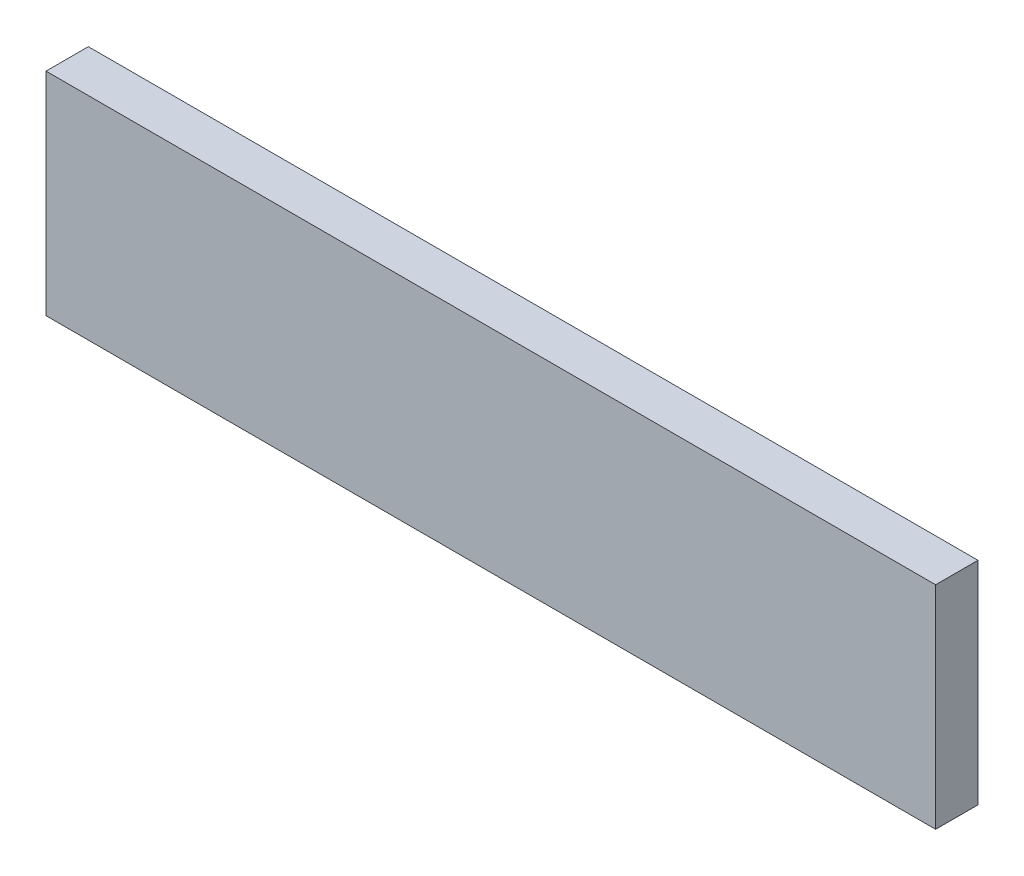
ISO-10303-21;
HEADER;
FILE_DESCRIPTION(('STEP AP214'),'2;1');
FILE_NAME('part.step','',(''),(''),'','','');
FILE_SCHEMA(('AUTOMOTIVE_DESIGN { 1 0 10303 214 1 1 1 1 }'));
ENDSEC;
DATA;
#1=APPLICATION_CONTEXT('core data for automotive mechanical design processes');
#2=APPLICATION_PROTOCOL_DEFINITION('international standard','automotive_design',2000,#1);
#3=PRODUCT_CONTEXT('',#1,'mechanical');
#4=PRODUCT('Part','Part','',(#3));
#5=PRODUCT_RELATED_PRODUCT_CATEGORY('part','',(#4));
#6=PRODUCT_DEFINITION_FORMATION('','',#4);
#7=PRODUCT_DEFINITION_CONTEXT('part definition',#1,'design');
#8=PRODUCT_DEFINITION('design','',#6,#7);
#9=PRODUCT_DEFINITION_SHAPE('','',#8);
#10=(LENGTH_UNIT() NAMED_UNIT(*) SI_UNIT(.MILLI.,.METRE.));
#11=(NAMED_UNIT(*) PLANE_ANGLE_UNIT() SI_UNIT($,.RADIAN.));
#12=(NAMED_UNIT(*) SI_UNIT($,.STERADIAN.) SOLID_ANGLE_UNIT());
#13=UNCERTAINTY_MEASURE_WITH_UNIT(LENGTH_MEASURE(1.E-05),#10,'distance_accuracy_value','');
#14=(GEOMETRIC_REPRESENTATION_CONTEXT(3) GLOBAL_UNCERTAINTY_ASSIGNED_CONTEXT((#13)) GLOBAL_UNIT_ASSIGNED_CONTEXT((#10,
#11,#12)) REPRESENTATION_CONTEXT('',''));
#15=CARTESIAN_POINT('',(0.,0.,0.));
#16=DIRECTION('',(0.,0.,1.));
#17=DIRECTION('',(1.,0.,0.));
#18=AXIS2_PLACEMENT_3D('',#15,#16,#17);
#19=CARTESIAN_POINT('',(0.,100.,0.));
#20=DIRECTION('',(1.,0.,0.));
#21=DIRECTION('',(0.,0.,-1.));
#22=AXIS2_PLACEMENT_3D('',#19,#20,#21);
#23=PLANE('',#22);
#24=DIRECTION('',(0.,0.,1.));
#25=VECTOR('',#24,1.);
#26=CARTESIAN_POINT('',(0.,0.,0.));
#27=LINE('',#26,#25);
#28=CARTESIAN_POINT('',(0.,0.,0.));
#29=VERTEX_POINT('',#28);
#30=CARTESIAN_POINT('',(0.,0.,20.));
#31=VERTEX_POINT('',#30);
#32=EDGE_CURVE('E107',#29,#31,#27,.T.);
#33=ORIENTED_EDGE('',*,*,#32,.T.);
#34=DIRECTION('',(0.,-1.,0.));
#35=VECTOR('',#34,1.);
#36=CARTESIAN_POINT('',(0.,100.,20.));
#37=LINE('',#36,#35);
#38=CARTESIAN_POINT('',(0.,100.,20.));
#39=VERTEX_POINT('',#38);
#40=EDGE_CURVE('E11',#39,#31,#37,.T.);
#41=ORIENTED_EDGE('',*,*,#40,.F.);
#42=DIRECTION('',(0.,0.,1.));
#43=VECTOR('',#42,1.);
#44=CARTESIAN_POINT('',(0.,100.,0.));
#45=LINE('',#44,#43);
#46=CARTESIAN_POINT('',(0.,100.,0.));
#47=VERTEX_POINT('',#46);
#48=EDGE_CURVE('E91',#47,#39,#45,.T.);
#49=ORIENTED_EDGE('',*,*,#48,.F.);
#50=DIRECTION('',(0.,-1.,0.));
#51=VECTOR('',#50,1.);
#52=CARTESIAN_POINT('',(0.,100.,0.));
#53=LINE('',#52,#51);
#54=EDGE_CURVE('E103',#47,#29,#53,.T.);
#55=ORIENTED_EDGE('',*,*,#54,.T.);
#56=EDGE_LOOP('',(#33,#41,#49,#55));
#57=FACE_BOUND('',#56,.T.);
#58=ADVANCED_FACE('F39',(#57),#23,.F.);
#59=CARTESIAN_POINT('',(0.,100.,20.));
#60=DIRECTION('',(0.,0.,-1.));
#61=DIRECTION('',(-1.,0.,0.));
#62=AXIS2_PLACEMENT_3D('',#59,#60,#61);
#63=PLANE('',#62);
#64=DIRECTION('',(1.,0.,0.));
#65=VECTOR('',#64,1.);
#66=CARTESIAN_POINT('',(0.,0.,20.));
#67=LINE('',#66,#65);
#68=CARTESIAN_POINT('',(420.,0.,20.));
#69=VERTEX_POINT('',#68);
#70=EDGE_CURVE('E96',#31,#69,#67,.T.);
#71=ORIENTED_EDGE('',*,*,#70,.T.);
#72=DIRECTION('',(0.,-1.,0.));
#73=VECTOR('',#72,1.);
#74=CARTESIAN_POINT('',(420.,100.,20.));
#75=LINE('',#74,#73);
#76=CARTESIAN_POINT('',(420.,100.,20.));
#77=VERTEX_POINT('',#76);
#78=EDGE_CURVE('E48',#77,#69,#75,.T.);
#79=ORIENTED_EDGE('',*,*,#78,.F.);
#80=DIRECTION('',(1.,0.,0.));
#81=VECTOR('',#80,1.);
#82=CARTESIAN_POINT('',(0.,100.,20.));
#83=LINE('',#82,#81);
#84=EDGE_CURVE('E86',#39,#77,#83,.T.);
#85=ORIENTED_EDGE('',*,*,#84,.F.);
#86=ORIENTED_EDGE('',*,*,#40,.T.);
#87=EDGE_LOOP('',(#71,#79,#85,#86));
#88=FACE_BOUND('',#87,.T.);
#89=ADVANCED_FACE('F95',(#88),#63,.F.);
#90=CARTESIAN_POINT('',(420.,100.,0.));
#91=DIRECTION('',(-1.,0.,0.));
#92=DIRECTION('',(0.,0.,1.));
#93=AXIS2_PLACEMENT_3D('',#90,#91,#92);
#94=PLANE('',#93);
#95=DIRECTION('',(0.,0.,-1.));
#96=VECTOR('',#95,1.);
#97=CARTESIAN_POINT('',(420.,0.,0.));
#98=LINE('',#97,#96);
#99=CARTESIAN_POINT('',(420.,0.,0.));
#100=VERTEX_POINT('',#99);
#101=EDGE_CURVE('E73',#69,#100,#98,.T.);
#102=ORIENTED_EDGE('',*,*,#101,.T.);
#103=DIRECTION('',(0.,-1.,0.));
#104=VECTOR('',#103,1.);
#105=CARTESIAN_POINT('',(420.,100.,0.));
#106=LINE('',#105,#104);
#107=CARTESIAN_POINT('',(420.,100.,0.));
#108=VERTEX_POINT('',#107);
#109=EDGE_CURVE('E98',#108,#100,#106,.T.);
#110=ORIENTED_EDGE('',*,*,#109,.F.);
#111=DIRECTION('',(0.,0.,-1.));
#112=VECTOR('',#111,1.);
#113=CARTESIAN_POINT('',(420.,100.,0.));
#114=LINE('',#113,#112);
#115=EDGE_CURVE('E89',#77,#108,#114,.T.);
#116=ORIENTED_EDGE('',*,*,#115,.F.);
#117=ORIENTED_EDGE('',*,*,#78,.T.);
#118=EDGE_LOOP('',(#102,#110,#116,#117));
#119=FACE_BOUND('',#118,.T.);
#120=ADVANCED_FACE('F99',(#119),#94,.F.);
#121=CARTESIAN_POINT('',(0.,100.,0.));
#122=DIRECTION('',(0.,0.,1.));
#123=DIRECTION('',(1.,0.,0.));
#124=AXIS2_PLACEMENT_3D('',#121,#122,#123);
#125=PLANE('',#124);
#126=DIRECTION('',(-1.,0.,0.));
#127=VECTOR('',#126,1.);
#128=CARTESIAN_POINT('',(0.,0.,0.));
#129=LINE('',#128,#127);
#130=EDGE_CURVE('E79',#100,#29,#129,.T.);
#131=ORIENTED_EDGE('',*,*,#130,.T.);
#132=ORIENTED_EDGE('',*,*,#54,.F.);
#133=DIRECTION('',(-1.,0.,0.));
#134=VECTOR('',#133,1.);
#135=CARTESIAN_POINT('',(0.,100.,0.));
#136=LINE('',#135,#134);
#137=EDGE_CURVE('E56',#108,#47,#136,.T.);
#138=ORIENTED_EDGE('',*,*,#137,.F.);
#139=ORIENTED_EDGE('',*,*,#109,.T.);
#140=EDGE_LOOP('',(#131,#132,#138,#139));
#141=FACE_BOUND('',#140,.T.);
#142=ADVANCED_FACE('F120',(#141),#125,.F.);
#143=CARTESIAN_POINT('',(0.,100.,0.));
#144=DIRECTION('',(0.,1.,0.));
#145=DIRECTION('',(0.,0.,1.));
#146=AXIS2_PLACEMENT_3D('',#143,#144,#145);
#147=PLANE('',#146);
#148=ORIENTED_EDGE('',*,*,#48,.T.);
#149=ORIENTED_EDGE('',*,*,#84,.T.);
#150=ORIENTED_EDGE('',*,*,#115,.T.);
#151=ORIENTED_EDGE('',*,*,#137,.T.);
#152=EDGE_LOOP('',(#148,#149,#150,#151));
#153=FACE_BOUND('',#152,.T.);
#154=ADVANCED_FACE('F87',(#153),#147,.T.);
#155=CARTESIAN_POINT('',(0.,0.,0.));
#156=DIRECTION('',(0.,1.,0.));
#157=DIRECTION('',(0.,0.,1.));
#158=AXIS2_PLACEMENT_3D('',#155,#156,#157);
#159=PLANE('',#158);
#160=ORIENTED_EDGE('',*,*,#32,.F.);
#161=ORIENTED_EDGE('',*,*,#130,.F.);
#162=ORIENTED_EDGE('',*,*,#101,.F.);
#163=ORIENTED_EDGE('',*,*,#70,.F.);
#164=EDGE_LOOP('',(#160,#161,#162,#163));
#165=FACE_BOUND('',#164,.T.);
#166=ADVANCED_FACE('F123',(#165),#159,.F.);
#167=CLOSED_SHELL('',(#58,#89,#120,#142,#154,#166));
#168=MANIFOLD_SOLID_BREP('B2',#167);
#169=ADVANCED_BREP_SHAPE_REPRESENTATION('',(#18,#168),#14);
#170=SHAPE_DEFINITION_REPRESENTATION(#9,#169);
ENDSEC;
END-ISO-10303-21;
